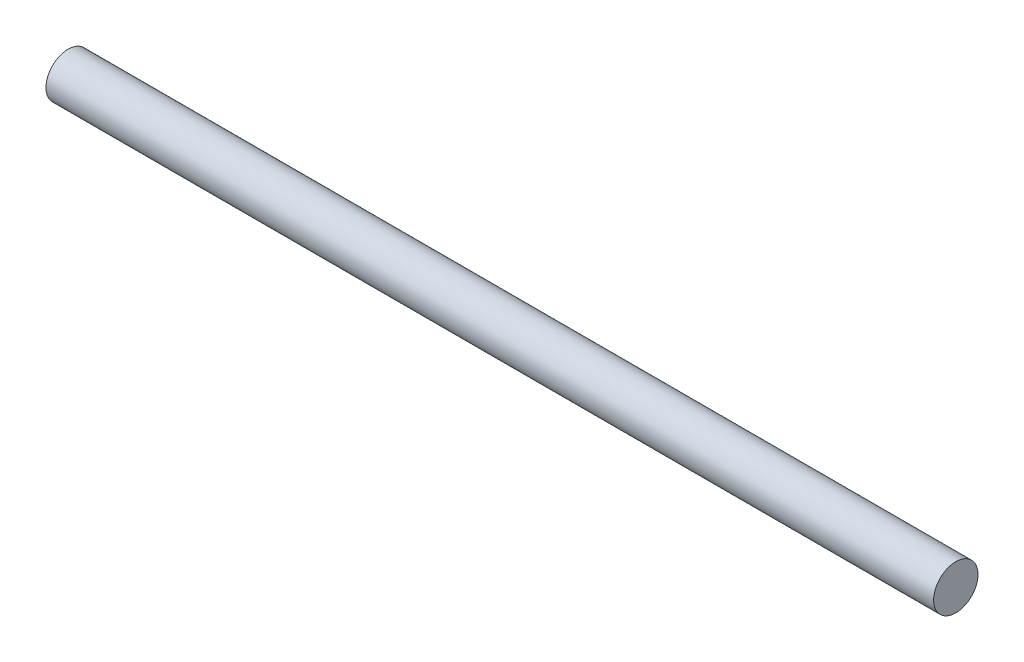
ISO-10303-21;
HEADER;
FILE_DESCRIPTION(('STEP AP214'),'2;1');
FILE_NAME('part.step','',(''),(''),'','','');
FILE_SCHEMA(('AUTOMOTIVE_DESIGN { 1 0 10303 214 1 1 1 1 }'));
ENDSEC;
DATA;
#1=APPLICATION_CONTEXT('core data for automotive mechanical design processes');
#2=APPLICATION_PROTOCOL_DEFINITION('international standard','automotive_design',2000,#1);
#3=PRODUCT_CONTEXT('',#1,'mechanical');
#4=PRODUCT('Part','Part','',(#3));
#5=PRODUCT_RELATED_PRODUCT_CATEGORY('part','',(#4));
#6=PRODUCT_DEFINITION_FORMATION('','',#4);
#7=PRODUCT_DEFINITION_CONTEXT('part definition',#1,'design');
#8=PRODUCT_DEFINITION('design','',#6,#7);
#9=PRODUCT_DEFINITION_SHAPE('','',#8);
#10=(LENGTH_UNIT() NAMED_UNIT(*) SI_UNIT(.MILLI.,.METRE.));
#11=(NAMED_UNIT(*) PLANE_ANGLE_UNIT() SI_UNIT($,.RADIAN.));
#12=(NAMED_UNIT(*) SI_UNIT($,.STERADIAN.) SOLID_ANGLE_UNIT());
#13=UNCERTAINTY_MEASURE_WITH_UNIT(LENGTH_MEASURE(1.E-05),#10,'distance_accuracy_value','');
#14=(GEOMETRIC_REPRESENTATION_CONTEXT(3) GLOBAL_UNCERTAINTY_ASSIGNED_CONTEXT((#13)) GLOBAL_UNIT_ASSIGNED_CONTEXT((#10,
#11,#12)) REPRESENTATION_CONTEXT('',''));
#15=CARTESIAN_POINT('',(0.,0.,0.));
#16=DIRECTION('',(0.,0.,1.));
#17=DIRECTION('',(1.,0.,0.));
#18=AXIS2_PLACEMENT_3D('',#15,#16,#17);
#19=CARTESIAN_POINT('',(63.5,0.,0.));
#20=DIRECTION('',(-1.,0.,0.));
#21=DIRECTION('',(0.,0.,1.));
#22=AXIS2_PLACEMENT_3D('',#19,#20,#21);
#23=CYLINDRICAL_SURFACE('',#22,3.175);
#24=CARTESIAN_POINT('',(63.5,0.,0.));
#25=DIRECTION('',(1.,0.,0.));
#26=DIRECTION('',(0.,0.,-1.));
#27=AXIS2_PLACEMENT_3D('',#24,#25,#26);
#28=CIRCLE('',#27,3.175);
#29=CARTESIAN_POINT('',(63.5,0.,-3.175));
#30=VERTEX_POINT('',#29);
#31=EDGE_CURVE('E10',#30,#30,#28,.T.);
#32=ORIENTED_EDGE('',*,*,#31,.F.);
#33=EDGE_LOOP('',(#32));
#34=FACE_BOUND('',#33,.T.);
#35=CARTESIAN_POINT('',(-63.5,0.,0.));
#36=DIRECTION('',(1.,0.,0.));
#37=DIRECTION('',(0.,0.,-1.));
#38=AXIS2_PLACEMENT_3D('',#35,#36,#37);
#39=CIRCLE('',#38,3.175);
#40=CARTESIAN_POINT('',(-63.5,0.,-3.175));
#41=VERTEX_POINT('',#40);
#42=EDGE_CURVE('E40',#41,#41,#39,.T.);
#43=ORIENTED_EDGE('',*,*,#42,.T.);
#44=EDGE_LOOP('',(#43));
#45=FACE_BOUND('',#44,.T.);
#46=ADVANCED_FACE('F37',(#34,#45),#23,.T.);
#47=CARTESIAN_POINT('',(63.5,0.,0.));
#48=DIRECTION('',(1.,0.,0.));
#49=DIRECTION('',(0.,0.,-1.));
#50=AXIS2_PLACEMENT_3D('',#47,#48,#49);
#51=PLANE('',#50);
#52=ORIENTED_EDGE('',*,*,#31,.T.);
#53=EDGE_LOOP('',(#52));
#54=FACE_BOUND('',#53,.T.);
#55=ADVANCED_FACE('F54',(#54),#51,.T.);
#56=CARTESIAN_POINT('',(-63.5,0.,0.));
#57=DIRECTION('',(1.,0.,0.));
#58=DIRECTION('',(0.,0.,-1.));
#59=AXIS2_PLACEMENT_3D('',#56,#57,#58);
#60=PLANE('',#59);
#61=ORIENTED_EDGE('',*,*,#42,.F.);
#62=EDGE_LOOP('',(#61));
#63=FACE_BOUND('',#62,.T.);
#64=ADVANCED_FACE('F52',(#63),#60,.F.);
#65=CLOSED_SHELL('',(#46,#55,#64));
#66=MANIFOLD_SOLID_BREP('B2',#65);
#67=ADVANCED_BREP_SHAPE_REPRESENTATION('',(#18,#66),#14);
#68=SHAPE_DEFINITION_REPRESENTATION(#9,#67);
ENDSEC;
END-ISO-10303-21;
